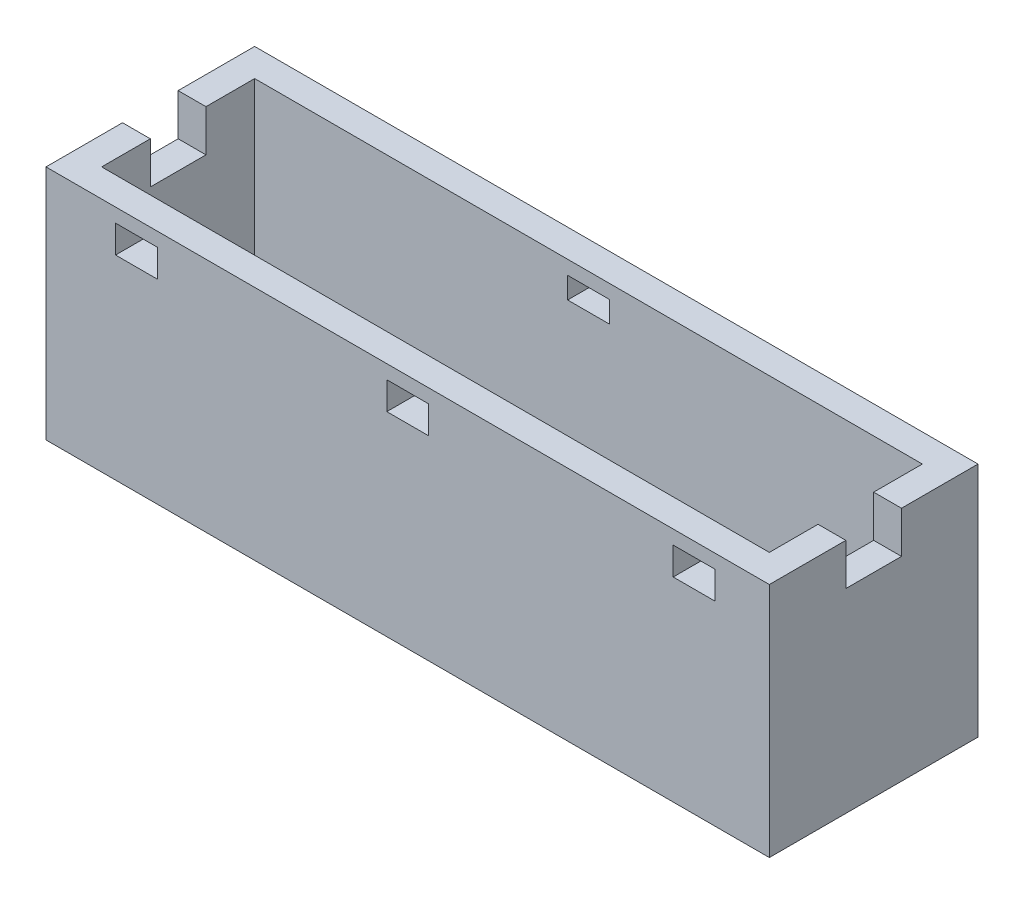
ISO-10303-21;
HEADER;
FILE_DESCRIPTION(('STEP AP214'),'2;1');
FILE_NAME('part.step','',(''),(''),'','','');
FILE_SCHEMA(('AUTOMOTIVE_DESIGN { 1 0 10303 214 1 1 1 1 }'));
ENDSEC;
DATA;
#1=APPLICATION_CONTEXT('core data for automotive mechanical design processes');
#2=APPLICATION_PROTOCOL_DEFINITION('international standard','automotive_design',2000,#1);
#3=PRODUCT_CONTEXT('',#1,'mechanical');
#4=PRODUCT('Part','Part','',(#3));
#5=PRODUCT_RELATED_PRODUCT_CATEGORY('part','',(#4));
#6=PRODUCT_DEFINITION_FORMATION('','',#4);
#7=PRODUCT_DEFINITION_CONTEXT('part definition',#1,'design');
#8=PRODUCT_DEFINITION('design','',#6,#7);
#9=PRODUCT_DEFINITION_SHAPE('','',#8);
#10=(LENGTH_UNIT() NAMED_UNIT(*) SI_UNIT(.MILLI.,.METRE.));
#11=(NAMED_UNIT(*) PLANE_ANGLE_UNIT() SI_UNIT($,.RADIAN.));
#12=(NAMED_UNIT(*) SI_UNIT($,.STERADIAN.) SOLID_ANGLE_UNIT());
#13=UNCERTAINTY_MEASURE_WITH_UNIT(LENGTH_MEASURE(1.E-05),#10,'distance_accuracy_value','');
#14=(GEOMETRIC_REPRESENTATION_CONTEXT(3) GLOBAL_UNCERTAINTY_ASSIGNED_CONTEXT((#13)) GLOBAL_UNIT_ASSIGNED_CONTEXT((#10,
#11,#12)) REPRESENTATION_CONTEXT('',''));
#15=CARTESIAN_POINT('',(0.,0.,0.));
#16=DIRECTION('',(0.,0.,1.));
#17=DIRECTION('',(1.,0.,0.));
#18=AXIS2_PLACEMENT_3D('',#15,#16,#17);
#19=CARTESIAN_POINT('',(0.,140.,0.));
#20=DIRECTION('',(0.,1.,0.));
#21=DIRECTION('',(0.,0.,1.));
#22=AXIS2_PLACEMENT_3D('',#19,#20,#21);
#23=PLANE('',#22);
#24=DIRECTION('',(-1.,0.,0.));
#25=VECTOR('',#24,1.);
#26=CARTESIAN_POINT('',(260.,140.,-20.0000000000002));
#27=LINE('',#26,#25);
#28=CARTESIAN_POINT('',(260.,140.,-20.0000000000002));
#29=VERTEX_POINT('',#28);
#30=CARTESIAN_POINT('',(240.,140.,-20.0000000000002));
#31=VERTEX_POINT('',#30);
#32=EDGE_CURVE('E360',#29,#31,#27,.T.);
#33=ORIENTED_EDGE('',*,*,#32,.F.);
#34=DIRECTION('',(0.,0.,-1.));
#35=VECTOR('',#34,1.);
#36=CARTESIAN_POINT('',(260.,140.,-75.));
#37=LINE('',#36,#35);
#38=CARTESIAN_POINT('',(260.,140.,-75.));
#39=VERTEX_POINT('',#38);
#40=EDGE_CURVE('E411',#29,#39,#37,.T.);
#41=ORIENTED_EDGE('',*,*,#40,.T.);
#42=DIRECTION('',(-1.,0.,0.));
#43=VECTOR('',#42,1.);
#44=CARTESIAN_POINT('',(-260.,140.,-75.));
#45=LINE('',#44,#43);
#46=CARTESIAN_POINT('',(-260.,140.,-75.));
#47=VERTEX_POINT('',#46);
#48=EDGE_CURVE('E422',#39,#47,#45,.T.);
#49=ORIENTED_EDGE('',*,*,#48,.T.);
#50=DIRECTION('',(0.,0.,1.));
#51=VECTOR('',#50,1.);
#52=CARTESIAN_POINT('',(-260.,140.,-75.));
#53=LINE('',#52,#51);
#54=CARTESIAN_POINT('',(-260.,140.,-20.));
#55=VERTEX_POINT('',#54);
#56=EDGE_CURVE('E425',#47,#55,#53,.T.);
#57=ORIENTED_EDGE('',*,*,#56,.T.);
#58=CARTESIAN_POINT('',(-240.,140.,-20.));
#59=VERTEX_POINT('',#58);
#60=EDGE_CURVE('E363',#59,#55,#27,.T.);
#61=ORIENTED_EDGE('',*,*,#60,.F.);
#62=DIRECTION('',(0.,0.,1.));
#63=VECTOR('',#62,1.);
#64=CARTESIAN_POINT('',(-240.,140.,-55.));
#65=LINE('',#64,#63);
#66=CARTESIAN_POINT('',(-240.,140.,-55.));
#67=VERTEX_POINT('',#66);
#68=EDGE_CURVE('E404',#67,#59,#65,.T.);
#69=ORIENTED_EDGE('',*,*,#68,.F.);
#70=DIRECTION('',(-1.,0.,0.));
#71=VECTOR('',#70,1.);
#72=CARTESIAN_POINT('',(-240.,140.,-55.));
#73=LINE('',#72,#71);
#74=CARTESIAN_POINT('',(240.,140.,-55.));
#75=VERTEX_POINT('',#74);
#76=EDGE_CURVE('E400',#75,#67,#73,.T.);
#77=ORIENTED_EDGE('',*,*,#76,.F.);
#78=DIRECTION('',(0.,0.,-1.));
#79=VECTOR('',#78,1.);
#80=CARTESIAN_POINT('',(240.,140.,-55.));
#81=LINE('',#80,#79);
#82=EDGE_CURVE('E382',#31,#75,#81,.T.);
#83=ORIENTED_EDGE('',*,*,#82,.F.);
#84=EDGE_LOOP('',(#33,#41,#49,#57,#61,#69,#77,#83));
#85=FACE_BOUND('',#84,.T.);
#86=ADVANCED_FACE('F33',(#85),#23,.T.);
#87=CARTESIAN_POINT('',(260.,140.,-75.));
#88=DIRECTION('',(-1.,0.,0.));
#89=DIRECTION('',(0.,0.,1.));
#90=AXIS2_PLACEMENT_3D('',#87,#88,#89);
#91=PLANE('',#90);
#92=ORIENTED_EDGE('',*,*,#40,.F.);
#93=DIRECTION('',(0.,-1.,0.));
#94=VECTOR('',#93,1.);
#95=CARTESIAN_POINT('',(260.,140.,-20.0000000000002));
#96=LINE('',#95,#94);
#97=CARTESIAN_POINT('',(260.,110.,-20.0000000000002));
#98=VERTEX_POINT('',#97);
#99=EDGE_CURVE('E343',#29,#98,#96,.T.);
#100=ORIENTED_EDGE('',*,*,#99,.T.);
#101=DIRECTION('',(0.,0.,1.));
#102=VECTOR('',#101,1.);
#103=CARTESIAN_POINT('',(260.,110.,-20.0000000000002));
#104=LINE('',#103,#102);
#105=CARTESIAN_POINT('',(260.,110.,19.9999999999998));
#106=VERTEX_POINT('',#105);
#107=EDGE_CURVE('E346',#98,#106,#104,.T.);
#108=ORIENTED_EDGE('',*,*,#107,.T.);
#109=DIRECTION('',(0.,1.,0.));
#110=VECTOR('',#109,1.);
#111=CARTESIAN_POINT('',(260.,140.,19.9999999999998));
#112=LINE('',#111,#110);
#113=CARTESIAN_POINT('',(260.,140.,19.9999999999998));
#114=VERTEX_POINT('',#113);
#115=EDGE_CURVE('E350',#106,#114,#112,.T.);
#116=ORIENTED_EDGE('',*,*,#115,.T.);
#117=CARTESIAN_POINT('',(260.,140.,75.));
#118=VERTEX_POINT('',#117);
#119=EDGE_CURVE('E419',#118,#114,#37,.T.);
#120=ORIENTED_EDGE('',*,*,#119,.F.);
#121=DIRECTION('',(0.,-1.,0.));
#122=VECTOR('',#121,1.);
#123=CARTESIAN_POINT('',(260.,140.,75.));
#124=LINE('',#123,#122);
#125=CARTESIAN_POINT('',(260.,-30.,75.));
#126=VERTEX_POINT('',#125);
#127=EDGE_CURVE('E430',#118,#126,#124,.T.);
#128=ORIENTED_EDGE('',*,*,#127,.T.);
#129=DIRECTION('',(0.,0.,1.));
#130=VECTOR('',#129,1.);
#131=CARTESIAN_POINT('',(260.,-30.,-75.));
#132=LINE('',#131,#130);
#133=CARTESIAN_POINT('',(260.,-30.,-75.));
#134=VERTEX_POINT('',#133);
#135=EDGE_CURVE('E336',#134,#126,#132,.T.);
#136=ORIENTED_EDGE('',*,*,#135,.F.);
#137=DIRECTION('',(0.,-1.,0.));
#138=VECTOR('',#137,1.);
#139=CARTESIAN_POINT('',(260.,140.,-75.));
#140=LINE('',#139,#138);
#141=EDGE_CURVE('E436',#39,#134,#140,.T.);
#142=ORIENTED_EDGE('',*,*,#141,.F.);
#143=EDGE_LOOP('',(#92,#100,#108,#116,#120,#128,#136,#142));
#144=FACE_BOUND('',#143,.T.);
#145=ADVANCED_FACE('F35',(#144),#91,.F.);
#146=CARTESIAN_POINT('',(-260.,140.,-75.));
#147=DIRECTION('',(0.,0.,1.));
#148=DIRECTION('',(1.,0.,0.));
#149=AXIS2_PLACEMENT_3D('',#146,#147,#148);
#150=PLANE('',#149);
#151=DIRECTION('',(1.,0.,0.));
#152=VECTOR('',#151,1.);
#153=CARTESIAN_POINT('',(15.,130.,-75.));
#154=LINE('',#153,#152);
#155=CARTESIAN_POINT('',(-15.0000000000001,130.,-75.));
#156=VERTEX_POINT('',#155);
#157=CARTESIAN_POINT('',(15.,130.,-75.));
#158=VERTEX_POINT('',#157);
#159=EDGE_CURVE('E312',#156,#158,#154,.T.);
#160=ORIENTED_EDGE('',*,*,#159,.F.);
#161=DIRECTION('',(0.,1.,0.));
#162=VECTOR('',#161,1.);
#163=CARTESIAN_POINT('',(-15.0000000000001,130.,-75.));
#164=LINE('',#163,#162);
#165=CARTESIAN_POINT('',(-15.0000000000001,114.647041027345,-75.));
#166=VERTEX_POINT('',#165);
#167=EDGE_CURVE('E304',#166,#156,#164,.T.);
#168=ORIENTED_EDGE('',*,*,#167,.F.);
#169=DIRECTION('',(-1.,0.,0.));
#170=VECTOR('',#169,1.);
#171=CARTESIAN_POINT('',(15.,114.647041027345,-75.));
#172=LINE('',#171,#170);
#173=CARTESIAN_POINT('',(15.,114.647041027345,-75.));
#174=VERTEX_POINT('',#173);
#175=EDGE_CURVE('E318',#174,#166,#172,.T.);
#176=ORIENTED_EDGE('',*,*,#175,.F.);
#177=DIRECTION('',(0.,-1.,0.));
#178=VECTOR('',#177,1.);
#179=CARTESIAN_POINT('',(15.,130.,-75.));
#180=LINE('',#179,#178);
#181=EDGE_CURVE('E315',#158,#174,#180,.T.);
#182=ORIENTED_EDGE('',*,*,#181,.F.);
#183=EDGE_LOOP('',(#160,#168,#176,#182));
#184=FACE_BOUND('',#183,.T.);
#185=ORIENTED_EDGE('',*,*,#141,.T.);
#186=DIRECTION('',(1.,0.,0.));
#187=VECTOR('',#186,1.);
#188=CARTESIAN_POINT('',(-260.,-30.,-75.));
#189=LINE('',#188,#187);
#190=CARTESIAN_POINT('',(-260.,-30.,-75.));
#191=VERTEX_POINT('',#190);
#192=EDGE_CURVE('E333',#191,#134,#189,.T.);
#193=ORIENTED_EDGE('',*,*,#192,.F.);
#194=DIRECTION('',(0.,-1.,0.));
#195=VECTOR('',#194,1.);
#196=CARTESIAN_POINT('',(-260.,140.,-75.));
#197=LINE('',#196,#195);
#198=EDGE_CURVE('E434',#47,#191,#197,.T.);
#199=ORIENTED_EDGE('',*,*,#198,.F.);
#200=ORIENTED_EDGE('',*,*,#48,.F.);
#201=EDGE_LOOP('',(#185,#193,#199,#200));
#202=FACE_BOUND('',#201,.T.);
#203=ADVANCED_FACE('F513',(#184,#202),#150,.F.);
#204=CARTESIAN_POINT('',(-260.,140.,-75.));
#205=DIRECTION('',(1.,0.,0.));
#206=DIRECTION('',(0.,0.,-1.));
#207=AXIS2_PLACEMENT_3D('',#204,#205,#206);
#208=PLANE('',#207);
#209=DIRECTION('',(0.,0.,1.));
#210=VECTOR('',#209,1.);
#211=CARTESIAN_POINT('',(-260.,110.,-20.));
#212=LINE('',#211,#210);
#213=CARTESIAN_POINT('',(-260.,110.,-20.));
#214=VERTEX_POINT('',#213);
#215=CARTESIAN_POINT('',(-260.,110.,20.));
#216=VERTEX_POINT('',#215);
#217=EDGE_CURVE('E356',#214,#216,#212,.T.);
#218=ORIENTED_EDGE('',*,*,#217,.F.);
#219=DIRECTION('',(0.,-1.,0.));
#220=VECTOR('',#219,1.);
#221=CARTESIAN_POINT('',(-260.,140.,-20.));
#222=LINE('',#221,#220);
#223=EDGE_CURVE('E342',#55,#214,#222,.T.);
#224=ORIENTED_EDGE('',*,*,#223,.F.);
#225=ORIENTED_EDGE('',*,*,#56,.F.);
#226=ORIENTED_EDGE('',*,*,#198,.T.);
#227=DIRECTION('',(0.,0.,-1.));
#228=VECTOR('',#227,1.);
#229=CARTESIAN_POINT('',(-260.,-30.,-75.));
#230=LINE('',#229,#228);
#231=CARTESIAN_POINT('',(-260.,-30.,75.));
#232=VERTEX_POINT('',#231);
#233=EDGE_CURVE('E324',#232,#191,#230,.T.);
#234=ORIENTED_EDGE('',*,*,#233,.F.);
#235=DIRECTION('',(0.,-1.,0.));
#236=VECTOR('',#235,1.);
#237=CARTESIAN_POINT('',(-260.,140.,75.));
#238=LINE('',#237,#236);
#239=CARTESIAN_POINT('',(-260.,140.,75.));
#240=VERTEX_POINT('',#239);
#241=EDGE_CURVE('E432',#240,#232,#238,.T.);
#242=ORIENTED_EDGE('',*,*,#241,.F.);
#243=CARTESIAN_POINT('',(-260.,140.,20.));
#244=VERTEX_POINT('',#243);
#245=EDGE_CURVE('E424',#244,#240,#53,.T.);
#246=ORIENTED_EDGE('',*,*,#245,.F.);
#247=DIRECTION('',(0.,1.,0.));
#248=VECTOR('',#247,1.);
#249=CARTESIAN_POINT('',(-260.,140.,20.));
#250=LINE('',#249,#248);
#251=EDGE_CURVE('E347',#216,#244,#250,.T.);
#252=ORIENTED_EDGE('',*,*,#251,.F.);
#253=EDGE_LOOP('',(#218,#224,#225,#226,#234,#242,#246,#252));
#254=FACE_BOUND('',#253,.T.);
#255=ADVANCED_FACE('F526',(#254),#208,.F.);
#256=CARTESIAN_POINT('',(-260.,140.,75.));
#257=DIRECTION('',(0.,0.,-1.));
#258=DIRECTION('',(-1.,0.,0.));
#259=AXIS2_PLACEMENT_3D('',#256,#257,#258);
#260=PLANE('',#259);
#261=DIRECTION('',(-1.,0.,0.));
#262=VECTOR('',#261,1.);
#263=CARTESIAN_POINT('',(190.891066665378,130.,75.));
#264=LINE('',#263,#262);
#265=CARTESIAN_POINT('',(220.891066665378,130.,75.));
#266=VERTEX_POINT('',#265);
#267=CARTESIAN_POINT('',(190.891066665378,130.,75.));
#268=VERTEX_POINT('',#267);
#269=EDGE_CURVE('E254',#266,#268,#264,.T.);
#270=ORIENTED_EDGE('',*,*,#269,.F.);
#271=DIRECTION('',(0.,1.,0.));
#272=VECTOR('',#271,1.);
#273=CARTESIAN_POINT('',(220.891066665378,130.,75.));
#274=LINE('',#273,#272);
#275=CARTESIAN_POINT('',(220.891066665378,110.12,75.));
#276=VERTEX_POINT('',#275);
#277=EDGE_CURVE('E48',#276,#266,#274,.T.);
#278=ORIENTED_EDGE('',*,*,#277,.F.);
#279=DIRECTION('',(1.,0.,0.));
#280=VECTOR('',#279,1.);
#281=CARTESIAN_POINT('',(190.891066665378,110.12,75.));
#282=LINE('',#281,#280);
#283=CARTESIAN_POINT('',(190.891066665378,110.12,75.));
#284=VERTEX_POINT('',#283);
#285=EDGE_CURVE('E261',#284,#276,#282,.T.);
#286=ORIENTED_EDGE('',*,*,#285,.F.);
#287=DIRECTION('',(0.,-1.,0.));
#288=VECTOR('',#287,1.);
#289=CARTESIAN_POINT('',(190.891066665378,130.,75.));
#290=LINE('',#289,#288);
#291=EDGE_CURVE('E245',#268,#284,#290,.T.);
#292=ORIENTED_EDGE('',*,*,#291,.F.);
#293=EDGE_LOOP('',(#270,#278,#286,#292));
#294=FACE_BOUND('',#293,.T.);
#295=DIRECTION('',(-1.,0.,0.));
#296=VECTOR('',#295,1.);
#297=CARTESIAN_POINT('',(-15.,130.,75.));
#298=LINE('',#297,#296);
#299=CARTESIAN_POINT('',(15.0000000000001,130.,75.));
#300=VERTEX_POINT('',#299);
#301=CARTESIAN_POINT('',(-15.,130.,75.));
#302=VERTEX_POINT('',#301);
#303=EDGE_CURVE('E272',#300,#302,#298,.T.);
#304=ORIENTED_EDGE('',*,*,#303,.F.);
#305=DIRECTION('',(0.,1.,0.));
#306=VECTOR('',#305,1.);
#307=CARTESIAN_POINT('',(15.,130.,75.));
#308=LINE('',#307,#306);
#309=CARTESIAN_POINT('',(15.,110.12,75.));
#310=VERTEX_POINT('',#309);
#311=EDGE_CURVE('E268',#310,#300,#308,.T.);
#312=ORIENTED_EDGE('',*,*,#311,.F.);
#313=DIRECTION('',(1.,0.,0.));
#314=VECTOR('',#313,1.);
#315=CARTESIAN_POINT('',(-15.,110.12,75.));
#316=LINE('',#315,#314);
#317=CARTESIAN_POINT('',(-15.,110.12,75.));
#318=VERTEX_POINT('',#317);
#319=EDGE_CURVE('E278',#318,#310,#316,.T.);
#320=ORIENTED_EDGE('',*,*,#319,.F.);
#321=DIRECTION('',(0.,-1.,0.));
#322=VECTOR('',#321,1.);
#323=CARTESIAN_POINT('',(-15.,130.,75.));
#324=LINE('',#323,#322);
#325=EDGE_CURVE('E275',#302,#318,#324,.T.);
#326=ORIENTED_EDGE('',*,*,#325,.F.);
#327=EDGE_LOOP('',(#304,#312,#320,#326));
#328=FACE_BOUND('',#327,.T.);
#329=DIRECTION('',(-1.,0.,0.));
#330=VECTOR('',#329,1.);
#331=CARTESIAN_POINT('',(-210.,130.,75.));
#332=LINE('',#331,#330);
#333=CARTESIAN_POINT('',(-180.,130.,75.));
#334=VERTEX_POINT('',#333);
#335=CARTESIAN_POINT('',(-210.,130.,75.));
#336=VERTEX_POINT('',#335);
#337=EDGE_CURVE('E292',#334,#336,#332,.T.);
#338=ORIENTED_EDGE('',*,*,#337,.F.);
#339=DIRECTION('',(0.,1.,0.));
#340=VECTOR('',#339,1.);
#341=CARTESIAN_POINT('',(-180.,130.,75.));
#342=LINE('',#341,#340);
#343=CARTESIAN_POINT('',(-180.,110.124383724971,75.));
#344=VERTEX_POINT('',#343);
#345=EDGE_CURVE('E284',#344,#334,#342,.T.);
#346=ORIENTED_EDGE('',*,*,#345,.F.);
#347=DIRECTION('',(1.,0.,0.));
#348=VECTOR('',#347,1.);
#349=CARTESIAN_POINT('',(-210.,110.124383724971,75.));
#350=LINE('',#349,#348);
#351=CARTESIAN_POINT('',(-210.,110.124383724971,75.));
#352=VERTEX_POINT('',#351);
#353=EDGE_CURVE('E298',#352,#344,#350,.T.);
#354=ORIENTED_EDGE('',*,*,#353,.F.);
#355=DIRECTION('',(0.,-1.,0.));
#356=VECTOR('',#355,1.);
#357=CARTESIAN_POINT('',(-210.,130.,75.));
#358=LINE('',#357,#356);
#359=EDGE_CURVE('E295',#336,#352,#358,.T.);
#360=ORIENTED_EDGE('',*,*,#359,.F.);
#361=EDGE_LOOP('',(#338,#346,#354,#360));
#362=FACE_BOUND('',#361,.T.);
#363=ORIENTED_EDGE('',*,*,#241,.T.);
#364=DIRECTION('',(-1.,0.,0.));
#365=VECTOR('',#364,1.);
#366=CARTESIAN_POINT('',(-260.,-30.,75.));
#367=LINE('',#366,#365);
#368=EDGE_CURVE('E339',#126,#232,#367,.T.);
#369=ORIENTED_EDGE('',*,*,#368,.F.);
#370=ORIENTED_EDGE('',*,*,#127,.F.);
#371=DIRECTION('',(1.,0.,0.));
#372=VECTOR('',#371,1.);
#373=CARTESIAN_POINT('',(-260.,140.,75.));
#374=LINE('',#373,#372);
#375=EDGE_CURVE('E428',#240,#118,#374,.T.);
#376=ORIENTED_EDGE('',*,*,#375,.F.);
#377=EDGE_LOOP('',(#363,#369,#370,#376));
#378=FACE_BOUND('',#377,.T.);
#379=ADVANCED_FACE('F258',(#294,#328,#362,#378),#260,.F.);
#380=DIRECTION('',(-1.,0.,0.));
#381=VECTOR('',#380,1.);
#382=CARTESIAN_POINT('',(260.,140.,19.9999999999998));
#383=LINE('',#382,#381);
#384=CARTESIAN_POINT('',(-240.,140.,20.));
#385=VERTEX_POINT('',#384);
#386=EDGE_CURVE('E367',#385,#244,#383,.T.);
#387=ORIENTED_EDGE('',*,*,#386,.T.);
#388=ORIENTED_EDGE('',*,*,#245,.T.);
#389=ORIENTED_EDGE('',*,*,#375,.T.);
#390=ORIENTED_EDGE('',*,*,#119,.T.);
#391=CARTESIAN_POINT('',(240.,140.,19.9999999999998));
#392=VERTEX_POINT('',#391);
#393=EDGE_CURVE('E364',#114,#392,#383,.T.);
#394=ORIENTED_EDGE('',*,*,#393,.T.);
#395=CARTESIAN_POINT('',(240.,140.,55.));
#396=VERTEX_POINT('',#395);
#397=EDGE_CURVE('E397',#396,#392,#81,.T.);
#398=ORIENTED_EDGE('',*,*,#397,.F.);
#399=DIRECTION('',(1.,0.,0.));
#400=VECTOR('',#399,1.);
#401=CARTESIAN_POINT('',(-240.,140.,55.));
#402=LINE('',#401,#400);
#403=CARTESIAN_POINT('',(-240.,140.,55.));
#404=VERTEX_POINT('',#403);
#405=EDGE_CURVE('E387',#404,#396,#402,.T.);
#406=ORIENTED_EDGE('',*,*,#405,.F.);
#407=EDGE_CURVE('E403',#385,#404,#65,.T.);
#408=ORIENTED_EDGE('',*,*,#407,.F.);
#409=EDGE_LOOP('',(#387,#388,#389,#390,#394,#398,#406,#408));
#410=FACE_BOUND('',#409,.T.);
#411=ADVANCED_FACE('F509',(#410),#23,.T.);
#412=CARTESIAN_POINT('',(240.,20.,-55.));
#413=DIRECTION('',(1.,0.,0.));
#414=DIRECTION('',(0.,0.,-1.));
#415=AXIS2_PLACEMENT_3D('',#412,#413,#414);
#416=PLANE('',#415);
#417=DIRECTION('',(0.,0.,-1.));
#418=VECTOR('',#417,1.);
#419=CARTESIAN_POINT('',(240.,110.,-55.));
#420=LINE('',#419,#418);
#421=CARTESIAN_POINT('',(240.,110.,19.9999999999998));
#422=VERTEX_POINT('',#421);
#423=CARTESIAN_POINT('',(240.,110.,-20.0000000000002));
#424=VERTEX_POINT('',#423);
#425=EDGE_CURVE('E362',#422,#424,#420,.T.);
#426=ORIENTED_EDGE('',*,*,#425,.T.);
#427=DIRECTION('',(0.,1.,0.));
#428=VECTOR('',#427,1.);
#429=CARTESIAN_POINT('',(240.,20.,-20.0000000000002));
#430=LINE('',#429,#428);
#431=EDGE_CURVE('E379',#424,#31,#430,.T.);
#432=ORIENTED_EDGE('',*,*,#431,.T.);
#433=ORIENTED_EDGE('',*,*,#82,.T.);
#434=DIRECTION('',(0.,1.,0.));
#435=VECTOR('',#434,1.);
#436=CARTESIAN_POINT('',(240.,20.,-55.));
#437=LINE('',#436,#435);
#438=CARTESIAN_POINT('',(240.,20.,-55.));
#439=VERTEX_POINT('',#438);
#440=EDGE_CURVE('E396',#439,#75,#437,.T.);
#441=ORIENTED_EDGE('',*,*,#440,.F.);
#442=DIRECTION('',(0.,0.,-1.));
#443=VECTOR('',#442,1.);
#444=CARTESIAN_POINT('',(240.,20.,-55.));
#445=LINE('',#444,#443);
#446=CARTESIAN_POINT('',(240.,20.,55.));
#447=VERTEX_POINT('',#446);
#448=EDGE_CURVE('E383',#447,#439,#445,.T.);
#449=ORIENTED_EDGE('',*,*,#448,.F.);
#450=DIRECTION('',(0.,1.,0.));
#451=VECTOR('',#450,1.);
#452=CARTESIAN_POINT('',(240.,20.,55.));
#453=LINE('',#452,#451);
#454=EDGE_CURVE('E409',#447,#396,#453,.T.);
#455=ORIENTED_EDGE('',*,*,#454,.T.);
#456=ORIENTED_EDGE('',*,*,#397,.T.);
#457=DIRECTION('',(0.,-1.,0.));
#458=VECTOR('',#457,1.);
#459=CARTESIAN_POINT('',(240.,20.,19.9999999999998));
#460=LINE('',#459,#458);
#461=EDGE_CURVE('E376',#392,#422,#460,.T.);
#462=ORIENTED_EDGE('',*,*,#461,.T.);
#463=EDGE_LOOP('',(#426,#432,#433,#441,#449,#455,#456,#462));
#464=FACE_BOUND('',#463,.T.);
#465=ADVANCED_FACE('F519',(#464),#416,.F.);
#466=CARTESIAN_POINT('',(-240.,20.,55.));
#467=DIRECTION('',(0.,0.,1.));
#468=DIRECTION('',(1.,0.,0.));
#469=AXIS2_PLACEMENT_3D('',#466,#467,#468);
#470=PLANE('',#469);
#471=DIRECTION('',(1.,0.,0.));
#472=VECTOR('',#471,1.);
#473=CARTESIAN_POINT('',(-240.,110.12,55.));
#474=LINE('',#473,#472);
#475=CARTESIAN_POINT('',(190.891066665378,110.12,55.));
#476=VERTEX_POINT('',#475);
#477=CARTESIAN_POINT('',(220.891066665378,110.12,55.));
#478=VERTEX_POINT('',#477);
#479=EDGE_CURVE('E41',#476,#478,#474,.T.);
#480=ORIENTED_EDGE('',*,*,#479,.T.);
#481=DIRECTION('',(0.,1.,0.));
#482=VECTOR('',#481,1.);
#483=CARTESIAN_POINT('',(220.891066665378,20.,55.));
#484=LINE('',#483,#482);
#485=CARTESIAN_POINT('',(220.891066665378,130.,55.));
#486=VERTEX_POINT('',#485);
#487=EDGE_CURVE('E11',#478,#486,#484,.T.);
#488=ORIENTED_EDGE('',*,*,#487,.T.);
#489=DIRECTION('',(-1.,0.,0.));
#490=VECTOR('',#489,1.);
#491=CARTESIAN_POINT('',(-240.,130.,55.));
#492=LINE('',#491,#490);
#493=CARTESIAN_POINT('',(190.891066665378,130.,55.));
#494=VERTEX_POINT('',#493);
#495=EDGE_CURVE('E483',#486,#494,#492,.T.);
#496=ORIENTED_EDGE('',*,*,#495,.T.);
#497=DIRECTION('',(0.,-1.,0.));
#498=VECTOR('',#497,1.);
#499=CARTESIAN_POINT('',(190.891066665378,20.,55.));
#500=LINE('',#499,#498);
#501=EDGE_CURVE('E248',#494,#476,#500,.T.);
#502=ORIENTED_EDGE('',*,*,#501,.T.);
#503=EDGE_LOOP('',(#480,#488,#496,#502));
#504=FACE_BOUND('',#503,.T.);
#505=DIRECTION('',(1.,0.,0.));
#506=VECTOR('',#505,1.);
#507=CARTESIAN_POINT('',(-240.,110.12,55.));
#508=LINE('',#507,#506);
#509=CARTESIAN_POINT('',(-15.,110.12,55.));
#510=VERTEX_POINT('',#509);
#511=CARTESIAN_POINT('',(15.,110.12,55.));
#512=VERTEX_POINT('',#511);
#513=EDGE_CURVE('E477',#510,#512,#508,.T.);
#514=ORIENTED_EDGE('',*,*,#513,.T.);
#515=DIRECTION('',(0.,1.,0.));
#516=VECTOR('',#515,1.);
#517=CARTESIAN_POINT('',(15.,20.,55.));
#518=LINE('',#517,#516);
#519=CARTESIAN_POINT('',(15.,130.,55.));
#520=VERTEX_POINT('',#519);
#521=EDGE_CURVE('E480',#512,#520,#518,.T.);
#522=ORIENTED_EDGE('',*,*,#521,.T.);
#523=DIRECTION('',(-1.,0.,0.));
#524=VECTOR('',#523,1.);
#525=CARTESIAN_POINT('',(-240.,130.,55.));
#526=LINE('',#525,#524);
#527=CARTESIAN_POINT('',(-15.,130.,55.));
#528=VERTEX_POINT('',#527);
#529=EDGE_CURVE('E471',#520,#528,#526,.T.);
#530=ORIENTED_EDGE('',*,*,#529,.T.);
#531=DIRECTION('',(0.,-1.,0.));
#532=VECTOR('',#531,1.);
#533=CARTESIAN_POINT('',(-15.,20.,55.));
#534=LINE('',#533,#532);
#535=EDGE_CURVE('E474',#528,#510,#534,.T.);
#536=ORIENTED_EDGE('',*,*,#535,.T.);
#537=EDGE_LOOP('',(#514,#522,#530,#536));
#538=FACE_BOUND('',#537,.T.);
#539=DIRECTION('',(1.,0.,0.));
#540=VECTOR('',#539,1.);
#541=CARTESIAN_POINT('',(-240.,110.124383724971,55.));
#542=LINE('',#541,#540);
#543=CARTESIAN_POINT('',(-210.,110.124383724971,55.));
#544=VERTEX_POINT('',#543);
#545=CARTESIAN_POINT('',(-180.,110.124383724971,55.));
#546=VERTEX_POINT('',#545);
#547=EDGE_CURVE('E465',#544,#546,#542,.T.);
#548=ORIENTED_EDGE('',*,*,#547,.T.);
#549=DIRECTION('',(0.,1.,0.));
#550=VECTOR('',#549,1.);
#551=CARTESIAN_POINT('',(-180.,20.0000000000001,55.));
#552=LINE('',#551,#550);
#553=CARTESIAN_POINT('',(-180.,130.,55.));
#554=VERTEX_POINT('',#553);
#555=EDGE_CURVE('E468',#546,#554,#552,.T.);
#556=ORIENTED_EDGE('',*,*,#555,.T.);
#557=DIRECTION('',(-1.,0.,0.));
#558=VECTOR('',#557,1.);
#559=CARTESIAN_POINT('',(-240.,130.,55.));
#560=LINE('',#559,#558);
#561=CARTESIAN_POINT('',(-210.,130.,55.));
#562=VERTEX_POINT('',#561);
#563=EDGE_CURVE('E459',#554,#562,#560,.T.);
#564=ORIENTED_EDGE('',*,*,#563,.T.);
#565=DIRECTION('',(0.,-1.,0.));
#566=VECTOR('',#565,1.);
#567=CARTESIAN_POINT('',(-210.,20.,55.));
#568=LINE('',#567,#566);
#569=EDGE_CURVE('E462',#562,#544,#568,.T.);
#570=ORIENTED_EDGE('',*,*,#569,.T.);
#571=EDGE_LOOP('',(#548,#556,#564,#570));
#572=FACE_BOUND('',#571,.T.);
#573=ORIENTED_EDGE('',*,*,#405,.T.);
#574=ORIENTED_EDGE('',*,*,#454,.F.);
#575=DIRECTION('',(1.,0.,0.));
#576=VECTOR('',#575,1.);
#577=CARTESIAN_POINT('',(-240.,20.,55.));
#578=LINE('',#577,#576);
#579=CARTESIAN_POINT('',(-240.,20.,55.));
#580=VERTEX_POINT('',#579);
#581=EDGE_CURVE('E393',#580,#447,#578,.T.);
#582=ORIENTED_EDGE('',*,*,#581,.F.);
#583=DIRECTION('',(0.,1.,0.));
#584=VECTOR('',#583,1.);
#585=CARTESIAN_POINT('',(-240.,20.,55.));
#586=LINE('',#585,#584);
#587=EDGE_CURVE('E412',#580,#404,#586,.T.);
#588=ORIENTED_EDGE('',*,*,#587,.T.);
#589=EDGE_LOOP('',(#573,#574,#582,#588));
#590=FACE_BOUND('',#589,.T.);
#591=ADVANCED_FACE('F487',(#504,#538,#572,#590),#470,.F.);
#592=CARTESIAN_POINT('',(-240.,20.,-55.));
#593=DIRECTION('',(-1.,0.,0.));
#594=DIRECTION('',(0.,0.,1.));
#595=AXIS2_PLACEMENT_3D('',#592,#593,#594);
#596=PLANE('',#595);
#597=ORIENTED_EDGE('',*,*,#68,.T.);
#598=DIRECTION('',(0.,-1.,0.));
#599=VECTOR('',#598,1.);
#600=CARTESIAN_POINT('',(-240.,20.,-20.));
#601=LINE('',#600,#599);
#602=CARTESIAN_POINT('',(-240.,110.,-20.));
#603=VERTEX_POINT('',#602);
#604=EDGE_CURVE('E444',#59,#603,#601,.T.);
#605=ORIENTED_EDGE('',*,*,#604,.T.);
#606=DIRECTION('',(0.,0.,1.));
#607=VECTOR('',#606,1.);
#608=CARTESIAN_POINT('',(-240.,110.,-55.));
#609=LINE('',#608,#607);
#610=CARTESIAN_POINT('',(-240.,110.,20.));
#611=VERTEX_POINT('',#610);
#612=EDGE_CURVE('E438',#603,#611,#609,.T.);
#613=ORIENTED_EDGE('',*,*,#612,.T.);
#614=DIRECTION('',(0.,1.,0.));
#615=VECTOR('',#614,1.);
#616=CARTESIAN_POINT('',(-240.,20.,20.));
#617=LINE('',#616,#615);
#618=EDGE_CURVE('E441',#611,#385,#617,.T.);
#619=ORIENTED_EDGE('',*,*,#618,.T.);
#620=ORIENTED_EDGE('',*,*,#407,.T.);
#621=ORIENTED_EDGE('',*,*,#587,.F.);
#622=DIRECTION('',(0.,0.,1.));
#623=VECTOR('',#622,1.);
#624=CARTESIAN_POINT('',(-240.,20.,-55.));
#625=LINE('',#624,#623);
#626=CARTESIAN_POINT('',(-240.,20.,-55.));
#627=VERTEX_POINT('',#626);
#628=EDGE_CURVE('E390',#627,#580,#625,.T.);
#629=ORIENTED_EDGE('',*,*,#628,.F.);
#630=DIRECTION('',(0.,1.,0.));
#631=VECTOR('',#630,1.);
#632=CARTESIAN_POINT('',(-240.,20.,-55.));
#633=LINE('',#632,#631);
#634=EDGE_CURVE('E415',#627,#67,#633,.T.);
#635=ORIENTED_EDGE('',*,*,#634,.T.);
#636=EDGE_LOOP('',(#597,#605,#613,#619,#620,#621,#629,#635));
#637=FACE_BOUND('',#636,.T.);
#638=ADVANCED_FACE('F555',(#637),#596,.F.);
#639=CARTESIAN_POINT('',(-240.,20.,-55.));
#640=DIRECTION('',(0.,0.,-1.));
#641=DIRECTION('',(-1.,0.,0.));
#642=AXIS2_PLACEMENT_3D('',#639,#640,#641);
#643=PLANE('',#642);
#644=DIRECTION('',(-1.,0.,0.));
#645=VECTOR('',#644,1.);
#646=CARTESIAN_POINT('',(-240.,114.647041027345,-55.));
#647=LINE('',#646,#645);
#648=CARTESIAN_POINT('',(15.,114.647041027345,-55.));
#649=VERTEX_POINT('',#648);
#650=CARTESIAN_POINT('',(-15.0000000000001,114.647041027345,-55.));
#651=VERTEX_POINT('',#650);
#652=EDGE_CURVE('E453',#649,#651,#647,.T.);
#653=ORIENTED_EDGE('',*,*,#652,.T.);
#654=DIRECTION('',(0.,1.,0.));
#655=VECTOR('',#654,1.);
#656=CARTESIAN_POINT('',(-15.0000000000001,20.,-55.));
#657=LINE('',#656,#655);
#658=CARTESIAN_POINT('',(-15.0000000000001,130.,-55.));
#659=VERTEX_POINT('',#658);
#660=EDGE_CURVE('E456',#651,#659,#657,.T.);
#661=ORIENTED_EDGE('',*,*,#660,.T.);
#662=DIRECTION('',(1.,0.,0.));
#663=VECTOR('',#662,1.);
#664=CARTESIAN_POINT('',(-240.,130.,-55.));
#665=LINE('',#664,#663);
#666=CARTESIAN_POINT('',(15.,130.,-55.));
#667=VERTEX_POINT('',#666);
#668=EDGE_CURVE('E447',#659,#667,#665,.T.);
#669=ORIENTED_EDGE('',*,*,#668,.T.);
#670=DIRECTION('',(0.,-1.,0.));
#671=VECTOR('',#670,1.);
#672=CARTESIAN_POINT('',(14.9999999999999,20.,-55.));
#673=LINE('',#672,#671);
#674=EDGE_CURVE('E450',#667,#649,#673,.T.);
#675=ORIENTED_EDGE('',*,*,#674,.T.);
#676=EDGE_LOOP('',(#653,#661,#669,#675));
#677=FACE_BOUND('',#676,.T.);
#678=ORIENTED_EDGE('',*,*,#76,.T.);
#679=ORIENTED_EDGE('',*,*,#634,.F.);
#680=DIRECTION('',(-1.,0.,0.));
#681=VECTOR('',#680,1.);
#682=CARTESIAN_POINT('',(-240.,20.,-55.));
#683=LINE('',#682,#681);
#684=EDGE_CURVE('E386',#439,#627,#683,.T.);
#685=ORIENTED_EDGE('',*,*,#684,.F.);
#686=ORIENTED_EDGE('',*,*,#440,.T.);
#687=EDGE_LOOP('',(#678,#679,#685,#686));
#688=FACE_BOUND('',#687,.T.);
#689=ADVANCED_FACE('F560',(#677,#688),#643,.F.);
#690=CARTESIAN_POINT('',(0.,20.,0.));
#691=DIRECTION('',(0.,1.,0.));
#692=DIRECTION('',(0.,0.,1.));
#693=AXIS2_PLACEMENT_3D('',#690,#691,#692);
#694=PLANE('',#693);
#695=ORIENTED_EDGE('',*,*,#448,.T.);
#696=ORIENTED_EDGE('',*,*,#684,.T.);
#697=ORIENTED_EDGE('',*,*,#628,.T.);
#698=ORIENTED_EDGE('',*,*,#581,.T.);
#699=EDGE_LOOP('',(#695,#696,#697,#698));
#700=FACE_BOUND('',#699,.T.);
#701=ADVANCED_FACE('F557',(#700),#694,.T.);
#702=CARTESIAN_POINT('',(260.,110.,-20.0000000000002));
#703=DIRECTION('',(0.,-1.,0.));
#704=DIRECTION('',(0.,0.,-1.));
#705=AXIS2_PLACEMENT_3D('',#702,#703,#704);
#706=PLANE('',#705);
#707=DIRECTION('',(-1.,0.,0.));
#708=VECTOR('',#707,1.);
#709=CARTESIAN_POINT('',(260.,110.,-20.0000000000002));
#710=LINE('',#709,#708);
#711=EDGE_CURVE('E353',#603,#214,#710,.T.);
#712=ORIENTED_EDGE('',*,*,#711,.T.);
#713=ORIENTED_EDGE('',*,*,#217,.T.);
#714=DIRECTION('',(-1.,0.,0.));
#715=VECTOR('',#714,1.);
#716=CARTESIAN_POINT('',(260.,110.,19.9999999999998));
#717=LINE('',#716,#715);
#718=EDGE_CURVE('E371',#611,#216,#717,.T.);
#719=ORIENTED_EDGE('',*,*,#718,.F.);
#720=ORIENTED_EDGE('',*,*,#612,.F.);
#721=EDGE_LOOP('',(#712,#713,#719,#720));
#722=FACE_BOUND('',#721,.T.);
#723=ADVANCED_FACE('F571',(#722),#706,.F.);
#724=CARTESIAN_POINT('',(260.,140.,19.9999999999998));
#725=DIRECTION('',(0.,0.,1.));
#726=DIRECTION('',(1.,0.,0.));
#727=AXIS2_PLACEMENT_3D('',#724,#725,#726);
#728=PLANE('',#727);
#729=ORIENTED_EDGE('',*,*,#718,.T.);
#730=ORIENTED_EDGE('',*,*,#251,.T.);
#731=ORIENTED_EDGE('',*,*,#386,.F.);
#732=ORIENTED_EDGE('',*,*,#618,.F.);
#733=EDGE_LOOP('',(#729,#730,#731,#732));
#734=FACE_BOUND('',#733,.T.);
#735=ADVANCED_FACE('F572',(#734),#728,.F.);
#736=CARTESIAN_POINT('',(260.,140.,-20.0000000000002));
#737=DIRECTION('',(0.,0.,-1.));
#738=DIRECTION('',(-1.,0.,0.));
#739=AXIS2_PLACEMENT_3D('',#736,#737,#738);
#740=PLANE('',#739);
#741=ORIENTED_EDGE('',*,*,#60,.T.);
#742=ORIENTED_EDGE('',*,*,#223,.T.);
#743=ORIENTED_EDGE('',*,*,#711,.F.);
#744=ORIENTED_EDGE('',*,*,#604,.F.);
#745=EDGE_LOOP('',(#741,#742,#743,#744));
#746=FACE_BOUND('',#745,.T.);
#747=ADVANCED_FACE('F568',(#746),#740,.F.);
#748=EDGE_CURVE('E372',#98,#424,#710,.T.);
#749=ORIENTED_EDGE('',*,*,#748,.F.);
#750=ORIENTED_EDGE('',*,*,#99,.F.);
#751=ORIENTED_EDGE('',*,*,#32,.T.);
#752=ORIENTED_EDGE('',*,*,#431,.F.);
#753=EDGE_LOOP('',(#749,#750,#751,#752));
#754=FACE_BOUND('',#753,.T.);
#755=ADVANCED_FACE('F579',(#754),#740,.F.);
#756=ORIENTED_EDGE('',*,*,#393,.F.);
#757=ORIENTED_EDGE('',*,*,#115,.F.);
#758=EDGE_CURVE('E368',#106,#422,#717,.T.);
#759=ORIENTED_EDGE('',*,*,#758,.T.);
#760=ORIENTED_EDGE('',*,*,#461,.F.);
#761=EDGE_LOOP('',(#756,#757,#759,#760));
#762=FACE_BOUND('',#761,.T.);
#763=ADVANCED_FACE('F549',(#762),#728,.F.);
#764=ORIENTED_EDGE('',*,*,#758,.F.);
#765=ORIENTED_EDGE('',*,*,#107,.F.);
#766=ORIENTED_EDGE('',*,*,#748,.T.);
#767=ORIENTED_EDGE('',*,*,#425,.F.);
#768=EDGE_LOOP('',(#764,#765,#766,#767));
#769=FACE_BOUND('',#768,.T.);
#770=ADVANCED_FACE('F582',(#769),#706,.F.);
#771=CARTESIAN_POINT('',(0.,-30.,0.));
#772=DIRECTION('',(0.,1.,0.));
#773=DIRECTION('',(0.,0.,1.));
#774=AXIS2_PLACEMENT_3D('',#771,#772,#773);
#775=PLANE('',#774);
#776=ORIENTED_EDGE('',*,*,#233,.T.);
#777=ORIENTED_EDGE('',*,*,#192,.T.);
#778=ORIENTED_EDGE('',*,*,#135,.T.);
#779=ORIENTED_EDGE('',*,*,#368,.T.);
#780=EDGE_LOOP('',(#776,#777,#778,#779));
#781=FACE_BOUND('',#780,.T.);
#782=ADVANCED_FACE('F589',(#781),#775,.F.);
#783=CARTESIAN_POINT('',(-15.0000000000001,130.,-45.));
#784=DIRECTION('',(-1.,0.,0.));
#785=DIRECTION('',(0.,-1.,0.));
#786=AXIS2_PLACEMENT_3D('',#783,#784,#785);
#787=PLANE('',#786);
#788=DIRECTION('',(0.,0.,-1.));
#789=VECTOR('',#788,1.);
#790=CARTESIAN_POINT('',(-15.0000000000001,114.647041027345,-45.));
#791=LINE('',#790,#789);
#792=EDGE_CURVE('E322',#651,#166,#791,.T.);
#793=ORIENTED_EDGE('',*,*,#792,.T.);
#794=ORIENTED_EDGE('',*,*,#167,.T.);
#795=DIRECTION('',(0.,0.,-1.));
#796=VECTOR('',#795,1.);
#797=CARTESIAN_POINT('',(-15.0000000000001,130.,-45.));
#798=LINE('',#797,#796);
#799=EDGE_CURVE('E321',#659,#156,#798,.T.);
#800=ORIENTED_EDGE('',*,*,#799,.F.);
#801=ORIENTED_EDGE('',*,*,#660,.F.);
#802=EDGE_LOOP('',(#793,#794,#800,#801));
#803=FACE_BOUND('',#802,.T.);
#804=ADVANCED_FACE('F620',(#803),#787,.F.);
#805=CARTESIAN_POINT('',(15.,114.647041027345,-45.));
#806=DIRECTION('',(0.,-1.,0.));
#807=DIRECTION('',(0.,0.,-1.));
#808=AXIS2_PLACEMENT_3D('',#805,#806,#807);
#809=PLANE('',#808);
#810=DIRECTION('',(0.,0.,-1.));
#811=VECTOR('',#810,1.);
#812=CARTESIAN_POINT('',(15.,114.647041027345,-45.));
#813=LINE('',#812,#811);
#814=EDGE_CURVE('E325',#649,#174,#813,.T.);
#815=ORIENTED_EDGE('',*,*,#814,.T.);
#816=ORIENTED_EDGE('',*,*,#175,.T.);
#817=ORIENTED_EDGE('',*,*,#792,.F.);
#818=ORIENTED_EDGE('',*,*,#652,.F.);
#819=EDGE_LOOP('',(#815,#816,#817,#818));
#820=FACE_BOUND('',#819,.T.);
#821=ADVANCED_FACE('F609',(#820),#809,.F.);
#822=CARTESIAN_POINT('',(15.,130.,-45.));
#823=DIRECTION('',(1.,0.,0.));
#824=DIRECTION('',(0.,0.,-1.));
#825=AXIS2_PLACEMENT_3D('',#822,#823,#824);
#826=PLANE('',#825);
#827=DIRECTION('',(0.,0.,-1.));
#828=VECTOR('',#827,1.);
#829=CARTESIAN_POINT('',(15.,130.,-45.));
#830=LINE('',#829,#828);
#831=EDGE_CURVE('E327',#667,#158,#830,.T.);
#832=ORIENTED_EDGE('',*,*,#831,.T.);
#833=ORIENTED_EDGE('',*,*,#181,.T.);
#834=ORIENTED_EDGE('',*,*,#814,.F.);
#835=ORIENTED_EDGE('',*,*,#674,.F.);
#836=EDGE_LOOP('',(#832,#833,#834,#835));
#837=FACE_BOUND('',#836,.T.);
#838=ADVANCED_FACE('F611',(#837),#826,.F.);
#839=CARTESIAN_POINT('',(15.,130.,-45.));
#840=DIRECTION('',(0.,1.,0.));
#841=DIRECTION('',(0.,0.,1.));
#842=AXIS2_PLACEMENT_3D('',#839,#840,#841);
#843=PLANE('',#842);
#844=ORIENTED_EDGE('',*,*,#799,.T.);
#845=ORIENTED_EDGE('',*,*,#159,.T.);
#846=ORIENTED_EDGE('',*,*,#831,.F.);
#847=ORIENTED_EDGE('',*,*,#668,.F.);
#848=EDGE_LOOP('',(#844,#845,#846,#847));
#849=FACE_BOUND('',#848,.T.);
#850=ADVANCED_FACE('F622',(#849),#843,.F.);
#851=CARTESIAN_POINT('',(-180.,130.,45.));
#852=DIRECTION('',(1.,0.,0.));
#853=DIRECTION('',(0.,1.,0.));
#854=AXIS2_PLACEMENT_3D('',#851,#852,#853);
#855=PLANE('',#854);
#856=DIRECTION('',(0.,0.,1.));
#857=VECTOR('',#856,1.);
#858=CARTESIAN_POINT('',(-180.,110.124383724971,45.));
#859=LINE('',#858,#857);
#860=EDGE_CURVE('E302',#546,#344,#859,.T.);
#861=ORIENTED_EDGE('',*,*,#860,.T.);
#862=ORIENTED_EDGE('',*,*,#345,.T.);
#863=DIRECTION('',(0.,0.,1.));
#864=VECTOR('',#863,1.);
#865=CARTESIAN_POINT('',(-180.,130.,45.));
#866=LINE('',#865,#864);
#867=EDGE_CURVE('E301',#554,#334,#866,.T.);
#868=ORIENTED_EDGE('',*,*,#867,.F.);
#869=ORIENTED_EDGE('',*,*,#555,.F.);
#870=EDGE_LOOP('',(#861,#862,#868,#869));
#871=FACE_BOUND('',#870,.T.);
#872=ADVANCED_FACE('F624',(#871),#855,.F.);
#873=CARTESIAN_POINT('',(-210.,110.124383724971,45.));
#874=DIRECTION('',(0.,-1.,0.));
#875=DIRECTION('',(0.,0.,-1.));
#876=AXIS2_PLACEMENT_3D('',#873,#874,#875);
#877=PLANE('',#876);
#878=DIRECTION('',(0.,0.,1.));
#879=VECTOR('',#878,1.);
#880=CARTESIAN_POINT('',(-210.,110.124383724971,45.));
#881=LINE('',#880,#879);
#882=EDGE_CURVE('E305',#544,#352,#881,.T.);
#883=ORIENTED_EDGE('',*,*,#882,.T.);
#884=ORIENTED_EDGE('',*,*,#353,.T.);
#885=ORIENTED_EDGE('',*,*,#860,.F.);
#886=ORIENTED_EDGE('',*,*,#547,.F.);
#887=EDGE_LOOP('',(#883,#884,#885,#886));
#888=FACE_BOUND('',#887,.T.);
#889=ADVANCED_FACE('F630',(#888),#877,.F.);
#890=CARTESIAN_POINT('',(-210.,130.,45.));
#891=DIRECTION('',(-1.,0.,0.));
#892=DIRECTION('',(0.,0.,1.));
#893=AXIS2_PLACEMENT_3D('',#890,#891,#892);
#894=PLANE('',#893);
#895=DIRECTION('',(0.,0.,1.));
#896=VECTOR('',#895,1.);
#897=CARTESIAN_POINT('',(-210.,130.,45.));
#898=LINE('',#897,#896);
#899=EDGE_CURVE('E307',#562,#336,#898,.T.);
#900=ORIENTED_EDGE('',*,*,#899,.T.);
#901=ORIENTED_EDGE('',*,*,#359,.T.);
#902=ORIENTED_EDGE('',*,*,#882,.F.);
#903=ORIENTED_EDGE('',*,*,#569,.F.);
#904=EDGE_LOOP('',(#900,#901,#902,#903));
#905=FACE_BOUND('',#904,.T.);
#906=ADVANCED_FACE('F734',(#905),#894,.F.);
#907=CARTESIAN_POINT('',(-210.,130.,45.));
#908=DIRECTION('',(0.,1.,0.));
#909=DIRECTION('',(0.,0.,1.));
#910=AXIS2_PLACEMENT_3D('',#907,#908,#909);
#911=PLANE('',#910);
#912=ORIENTED_EDGE('',*,*,#867,.T.);
#913=ORIENTED_EDGE('',*,*,#337,.T.);
#914=ORIENTED_EDGE('',*,*,#899,.F.);
#915=ORIENTED_EDGE('',*,*,#563,.F.);
#916=EDGE_LOOP('',(#912,#913,#914,#915));
#917=FACE_BOUND('',#916,.T.);
#918=ADVANCED_FACE('F725',(#917),#911,.F.);
#919=CARTESIAN_POINT('',(15.,130.,45.));
#920=DIRECTION('',(1.,0.,0.));
#921=DIRECTION('',(0.,1.,0.));
#922=AXIS2_PLACEMENT_3D('',#919,#920,#921);
#923=PLANE('',#922);
#924=DIRECTION('',(0.,0.,1.));
#925=VECTOR('',#924,1.);
#926=CARTESIAN_POINT('',(15.,110.12,45.));
#927=LINE('',#926,#925);
#928=EDGE_CURVE('E282',#512,#310,#927,.T.);
#929=ORIENTED_EDGE('',*,*,#928,.T.);
#930=ORIENTED_EDGE('',*,*,#311,.T.);
#931=DIRECTION('',(0.,0.,1.));
#932=VECTOR('',#931,1.);
#933=CARTESIAN_POINT('',(15.,130.,45.));
#934=LINE('',#933,#932);
#935=EDGE_CURVE('E281',#520,#300,#934,.T.);
#936=ORIENTED_EDGE('',*,*,#935,.F.);
#937=ORIENTED_EDGE('',*,*,#521,.F.);
#938=EDGE_LOOP('',(#929,#930,#936,#937));
#939=FACE_BOUND('',#938,.T.);
#940=ADVANCED_FACE('F717',(#939),#923,.F.);
#941=CARTESIAN_POINT('',(-15.,110.12,45.));
#942=DIRECTION('',(0.,-1.,0.));
#943=DIRECTION('',(0.,0.,-1.));
#944=AXIS2_PLACEMENT_3D('',#941,#942,#943);
#945=PLANE('',#944);
#946=DIRECTION('',(0.,0.,1.));
#947=VECTOR('',#946,1.);
#948=CARTESIAN_POINT('',(-15.,110.12,45.));
#949=LINE('',#948,#947);
#950=EDGE_CURVE('E285',#510,#318,#949,.T.);
#951=ORIENTED_EDGE('',*,*,#950,.T.);
#952=ORIENTED_EDGE('',*,*,#319,.T.);
#953=ORIENTED_EDGE('',*,*,#928,.F.);
#954=ORIENTED_EDGE('',*,*,#513,.F.);
#955=EDGE_LOOP('',(#951,#952,#953,#954));
#956=FACE_BOUND('',#955,.T.);
#957=ADVANCED_FACE('F708',(#956),#945,.F.);
#958=CARTESIAN_POINT('',(-15.,130.,45.));
#959=DIRECTION('',(-1.,0.,0.));
#960=DIRECTION('',(0.,-1.,0.));
#961=AXIS2_PLACEMENT_3D('',#958,#959,#960);
#962=PLANE('',#961);
#963=DIRECTION('',(0.,0.,1.));
#964=VECTOR('',#963,1.);
#965=CARTESIAN_POINT('',(-15.,130.,45.));
#966=LINE('',#965,#964);
#967=EDGE_CURVE('E287',#528,#302,#966,.T.);
#968=ORIENTED_EDGE('',*,*,#967,.T.);
#969=ORIENTED_EDGE('',*,*,#325,.T.);
#970=ORIENTED_EDGE('',*,*,#950,.F.);
#971=ORIENTED_EDGE('',*,*,#535,.F.);
#972=EDGE_LOOP('',(#968,#969,#970,#971));
#973=FACE_BOUND('',#972,.T.);
#974=ADVANCED_FACE('F501',(#973),#962,.F.);
#975=CARTESIAN_POINT('',(-15.,130.,45.));
#976=DIRECTION('',(0.,1.,0.));
#977=DIRECTION('',(0.,0.,1.));
#978=AXIS2_PLACEMENT_3D('',#975,#976,#977);
#979=PLANE('',#978);
#980=ORIENTED_EDGE('',*,*,#935,.T.);
#981=ORIENTED_EDGE('',*,*,#303,.T.);
#982=ORIENTED_EDGE('',*,*,#967,.F.);
#983=ORIENTED_EDGE('',*,*,#529,.F.);
#984=EDGE_LOOP('',(#980,#981,#982,#983));
#985=FACE_BOUND('',#984,.T.);
#986=ADVANCED_FACE('F494',(#985),#979,.F.);
#987=CARTESIAN_POINT('',(220.891066665378,130.,45.));
#988=DIRECTION('',(1.,0.,0.));
#989=DIRECTION('',(0.,0.,-1.));
#990=AXIS2_PLACEMENT_3D('',#987,#988,#989);
#991=PLANE('',#990);
#992=DIRECTION('',(0.,0.,1.));
#993=VECTOR('',#992,1.);
#994=CARTESIAN_POINT('',(220.891066665378,110.12,45.));
#995=LINE('',#994,#993);
#996=EDGE_CURVE('E266',#478,#276,#995,.T.);
#997=ORIENTED_EDGE('',*,*,#996,.T.);
#998=ORIENTED_EDGE('',*,*,#277,.T.);
#999=DIRECTION('',(0.,0.,1.));
#1000=VECTOR('',#999,1.);
#1001=CARTESIAN_POINT('',(220.891066665378,130.,45.));
#1002=LINE('',#1001,#1000);
#1003=EDGE_CURVE('E251',#486,#266,#1002,.T.);
#1004=ORIENTED_EDGE('',*,*,#1003,.F.);
#1005=ORIENTED_EDGE('',*,*,#487,.F.);
#1006=EDGE_LOOP('',(#997,#998,#1004,#1005));
#1007=FACE_BOUND('',#1006,.T.);
#1008=ADVANCED_FACE('F492',(#1007),#991,.F.);
#1009=CARTESIAN_POINT('',(190.891066665378,110.12,45.));
#1010=DIRECTION('',(0.,-1.,0.));
#1011=DIRECTION('',(0.,0.,-1.));
#1012=AXIS2_PLACEMENT_3D('',#1009,#1010,#1011);
#1013=PLANE('',#1012);
#1014=DIRECTION('',(0.,0.,1.));
#1015=VECTOR('',#1014,1.);
#1016=CARTESIAN_POINT('',(190.891066665378,110.12,45.));
#1017=LINE('',#1016,#1015);
#1018=EDGE_CURVE('E250',#476,#284,#1017,.T.);
#1019=ORIENTED_EDGE('',*,*,#1018,.T.);
#1020=ORIENTED_EDGE('',*,*,#285,.T.);
#1021=ORIENTED_EDGE('',*,*,#996,.F.);
#1022=ORIENTED_EDGE('',*,*,#479,.F.);
#1023=EDGE_LOOP('',(#1019,#1020,#1021,#1022));
#1024=FACE_BOUND('',#1023,.T.);
#1025=ADVANCED_FACE('F491',(#1024),#1013,.F.);
#1026=CARTESIAN_POINT('',(190.891066665378,130.,45.));
#1027=DIRECTION('',(-1.,0.,0.));
#1028=DIRECTION('',(0.,0.,1.));
#1029=AXIS2_PLACEMENT_3D('',#1026,#1027,#1028);
#1030=PLANE('',#1029);
#1031=DIRECTION('',(0.,0.,1.));
#1032=VECTOR('',#1031,1.);
#1033=CARTESIAN_POINT('',(190.891066665378,130.,45.));
#1034=LINE('',#1033,#1032);
#1035=EDGE_CURVE('E56',#494,#268,#1034,.T.);
#1036=ORIENTED_EDGE('',*,*,#1035,.T.);
#1037=ORIENTED_EDGE('',*,*,#291,.T.);
#1038=ORIENTED_EDGE('',*,*,#1018,.F.);
#1039=ORIENTED_EDGE('',*,*,#501,.F.);
#1040=EDGE_LOOP('',(#1036,#1037,#1038,#1039));
#1041=FACE_BOUND('',#1040,.T.);
#1042=ADVANCED_FACE('F242',(#1041),#1030,.F.);
#1043=CARTESIAN_POINT('',(190.891066665378,130.,45.));
#1044=DIRECTION('',(0.,1.,0.));
#1045=DIRECTION('',(0.,0.,1.));
#1046=AXIS2_PLACEMENT_3D('',#1043,#1044,#1045);
#1047=PLANE('',#1046);
#1048=ORIENTED_EDGE('',*,*,#1003,.T.);
#1049=ORIENTED_EDGE('',*,*,#269,.T.);
#1050=ORIENTED_EDGE('',*,*,#1035,.F.);
#1051=ORIENTED_EDGE('',*,*,#495,.F.);
#1052=EDGE_LOOP('',(#1048,#1049,#1050,#1051));
#1053=FACE_BOUND('',#1052,.T.);
#1054=ADVANCED_FACE('F255',(#1053),#1047,.F.);
#1055=CLOSED_SHELL('',(#86,#145,#203,#255,#379,#411,#465,#591,#638,#689,#701,#723,#735,#747,
#755,#763,#770,#782,#804,#821,#838,#850,#872,#889,#906,#918,#940,#957,#974,#986,#1008,#1025,
#1042,#1054));
#1056=MANIFOLD_SOLID_BREP('B2',#1055);
#1057=ADVANCED_BREP_SHAPE_REPRESENTATION('',(#18,#1056),#14);
#1058=SHAPE_DEFINITION_REPRESENTATION(#9,#1057);
ENDSEC;
END-ISO-10303-21;
